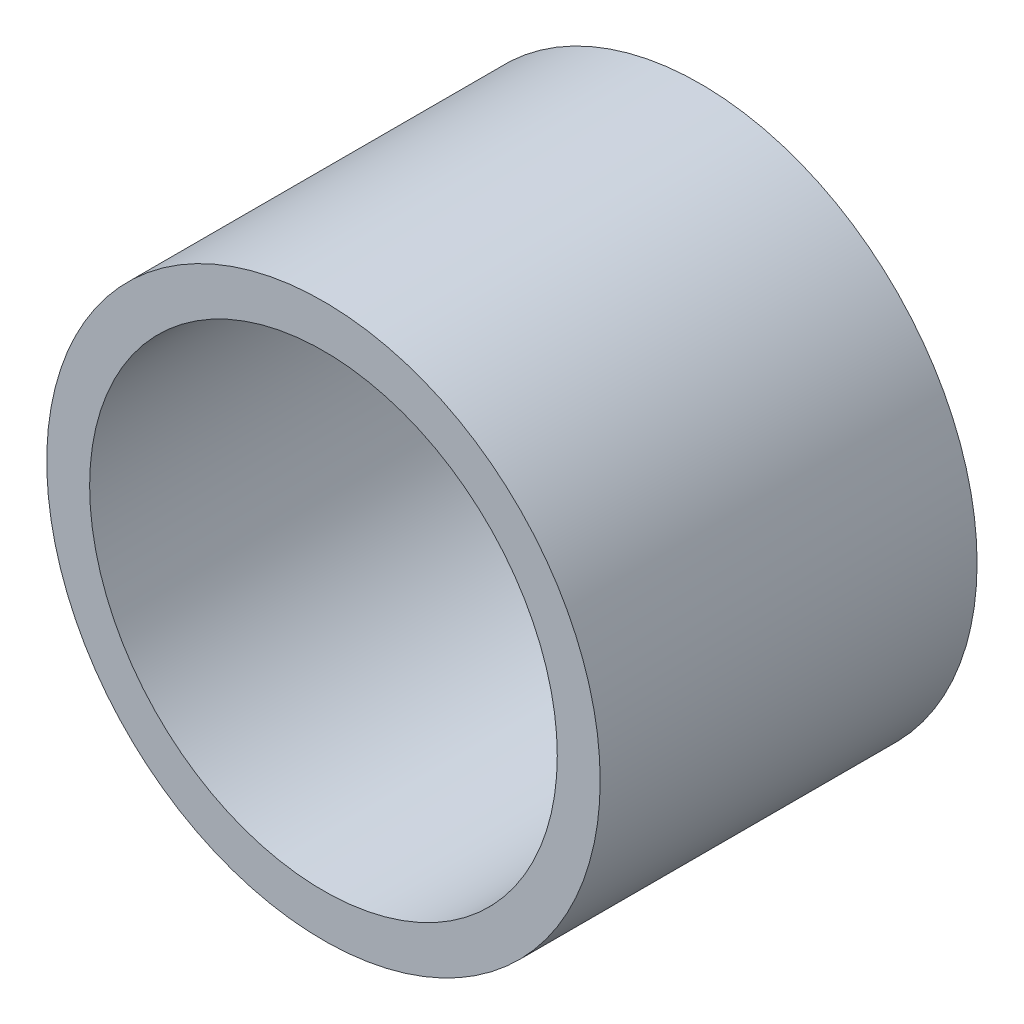
ISO-10303-21;
HEADER;
FILE_DESCRIPTION(('STEP AP214'),'2;1');
FILE_NAME('part.step','',(''),(''),'','','');
FILE_SCHEMA(('AUTOMOTIVE_DESIGN { 1 0 10303 214 1 1 1 1 }'));
ENDSEC;
DATA;
#1=APPLICATION_CONTEXT('core data for automotive mechanical design processes');
#2=APPLICATION_PROTOCOL_DEFINITION('international standard','automotive_design',2000,#1);
#3=PRODUCT_CONTEXT('',#1,'mechanical');
#4=PRODUCT('Part','Part','',(#3));
#5=PRODUCT_RELATED_PRODUCT_CATEGORY('part','',(#4));
#6=PRODUCT_DEFINITION_FORMATION('','',#4);
#7=PRODUCT_DEFINITION_CONTEXT('part definition',#1,'design');
#8=PRODUCT_DEFINITION('design','',#6,#7);
#9=PRODUCT_DEFINITION_SHAPE('','',#8);
#10=(LENGTH_UNIT() NAMED_UNIT(*) SI_UNIT(.MILLI.,.METRE.));
#11=(NAMED_UNIT(*) PLANE_ANGLE_UNIT() SI_UNIT($,.RADIAN.));
#12=(NAMED_UNIT(*) SI_UNIT($,.STERADIAN.) SOLID_ANGLE_UNIT());
#13=UNCERTAINTY_MEASURE_WITH_UNIT(LENGTH_MEASURE(1.E-05),#10,'distance_accuracy_value','');
#14=(GEOMETRIC_REPRESENTATION_CONTEXT(3) GLOBAL_UNCERTAINTY_ASSIGNED_CONTEXT((#13)) GLOBAL_UNIT_ASSIGNED_CONTEXT((#10,
#11,#12)) REPRESENTATION_CONTEXT('',''));
#15=CARTESIAN_POINT('',(0.,0.,0.));
#16=DIRECTION('',(0.,0.,1.));
#17=DIRECTION('',(1.,0.,0.));
#18=AXIS2_PLACEMENT_3D('',#15,#16,#17);
#19=CARTESIAN_POINT('',(0.,0.,68.1));
#20=DIRECTION('',(0.,0.,1.));
#21=DIRECTION('',(1.,0.,0.));
#22=AXIS2_PLACEMENT_3D('',#19,#20,#21);
#23=PLANE('',#22);
#24=CARTESIAN_POINT('',(0.,0.,68.1));
#25=DIRECTION('',(0.,0.,1.));
#26=DIRECTION('',(1.,0.,0.));
#27=AXIS2_PLACEMENT_3D('',#24,#25,#26);
#28=CIRCLE('',#27,50.);
#29=CARTESIAN_POINT('',(50.,0.,68.1));
#30=VERTEX_POINT('',#29);
#31=EDGE_CURVE('E10',#30,#30,#28,.T.);
#32=ORIENTED_EDGE('',*,*,#31,.T.);
#33=EDGE_LOOP('',(#32));
#34=FACE_BOUND('',#33,.T.);
#35=CARTESIAN_POINT('',(0.,0.,68.1));
#36=DIRECTION('',(0.,0.,1.));
#37=DIRECTION('',(1.,0.,0.));
#38=AXIS2_PLACEMENT_3D('',#35,#36,#37);
#39=CIRCLE('',#38,42.25);
#40=CARTESIAN_POINT('',(42.25,0.,68.1));
#41=VERTEX_POINT('',#40);
#42=EDGE_CURVE('E46',#41,#41,#39,.T.);
#43=ORIENTED_EDGE('',*,*,#42,.F.);
#44=EDGE_LOOP('',(#43));
#45=FACE_BOUND('',#44,.T.);
#46=ADVANCED_FACE('F35',(#34,#45),#23,.T.);
#47=CARTESIAN_POINT('',(0.,0.,0.));
#48=DIRECTION('',(0.,0.,1.));
#49=DIRECTION('',(1.,0.,0.));
#50=AXIS2_PLACEMENT_3D('',#47,#48,#49);
#51=PLANE('',#50);
#52=CARTESIAN_POINT('',(0.,0.,0.));
#53=DIRECTION('',(0.,0.,1.));
#54=DIRECTION('',(1.,0.,0.));
#55=AXIS2_PLACEMENT_3D('',#52,#53,#54);
#56=CIRCLE('',#55,50.);
#57=CARTESIAN_POINT('',(50.,0.,0.));
#58=VERTEX_POINT('',#57);
#59=EDGE_CURVE('E39',#58,#58,#56,.T.);
#60=ORIENTED_EDGE('',*,*,#59,.F.);
#61=EDGE_LOOP('',(#60));
#62=FACE_BOUND('',#61,.T.);
#63=CARTESIAN_POINT('',(0.,0.,0.));
#64=DIRECTION('',(0.,0.,1.));
#65=DIRECTION('',(1.,0.,0.));
#66=AXIS2_PLACEMENT_3D('',#63,#64,#65);
#67=CIRCLE('',#66,42.25);
#68=CARTESIAN_POINT('',(42.25,0.,0.));
#69=VERTEX_POINT('',#68);
#70=EDGE_CURVE('E48',#69,#69,#67,.T.);
#71=ORIENTED_EDGE('',*,*,#70,.T.);
#72=EDGE_LOOP('',(#71));
#73=FACE_BOUND('',#72,.T.);
#74=ADVANCED_FACE('F58',(#62,#73),#51,.F.);
#75=CARTESIAN_POINT('',(0.,0.,68.1));
#76=DIRECTION('',(0.,0.,-1.));
#77=DIRECTION('',(-1.,0.,0.));
#78=AXIS2_PLACEMENT_3D('',#75,#76,#77);
#79=CYLINDRICAL_SURFACE('',#78,50.);
#80=ORIENTED_EDGE('',*,*,#31,.F.);
#81=EDGE_LOOP('',(#80));
#82=FACE_BOUND('',#81,.T.);
#83=ORIENTED_EDGE('',*,*,#59,.T.);
#84=EDGE_LOOP('',(#83));
#85=FACE_BOUND('',#84,.T.);
#86=ADVANCED_FACE('F37',(#82,#85),#79,.T.);
#87=CARTESIAN_POINT('',(0.,0.,68.1));
#88=DIRECTION('',(0.,0.,-1.));
#89=DIRECTION('',(-1.,0.,0.));
#90=AXIS2_PLACEMENT_3D('',#87,#88,#89);
#91=CYLINDRICAL_SURFACE('',#90,42.25);
#92=ORIENTED_EDGE('',*,*,#42,.T.);
#93=EDGE_LOOP('',(#92));
#94=FACE_BOUND('',#93,.T.);
#95=ORIENTED_EDGE('',*,*,#70,.F.);
#96=EDGE_LOOP('',(#95));
#97=FACE_BOUND('',#96,.T.);
#98=ADVANCED_FACE('F54',(#94,#97),#91,.F.);
#99=CLOSED_SHELL('',(#46,#74,#86,#98));
#100=MANIFOLD_SOLID_BREP('B2',#99);
#101=ADVANCED_BREP_SHAPE_REPRESENTATION('',(#18,#100),#14);
#102=SHAPE_DEFINITION_REPRESENTATION(#9,#101);
ENDSEC;
END-ISO-10303-21;
